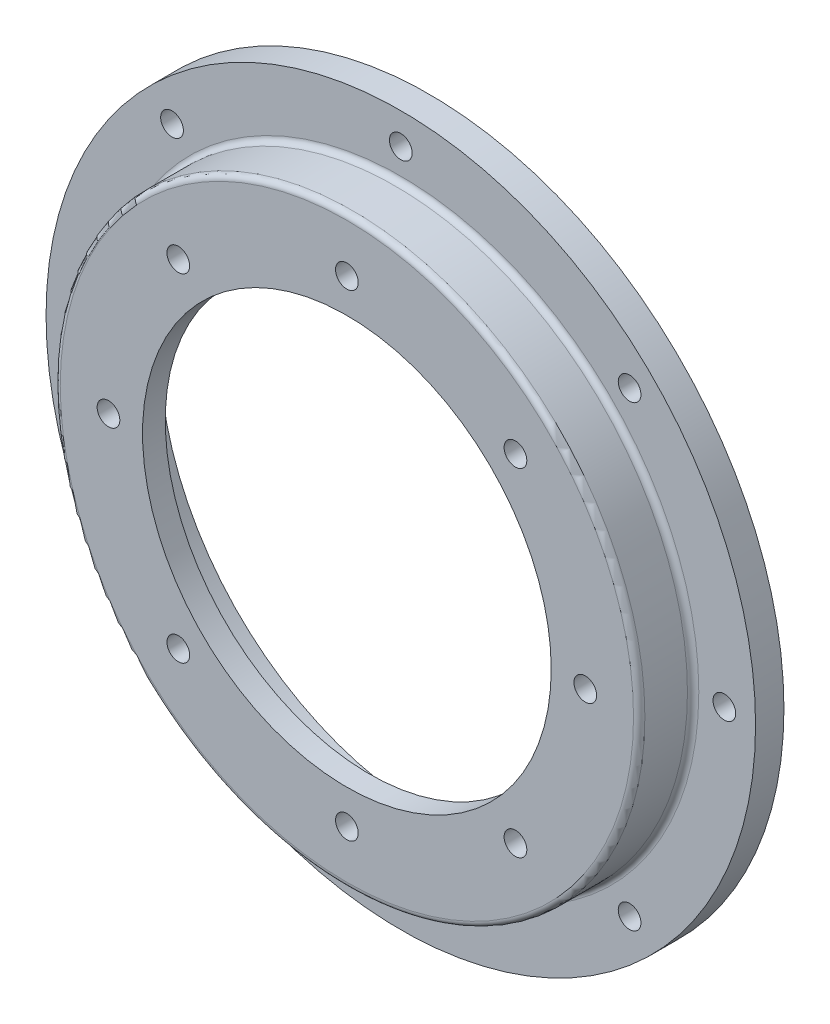
ISO-10303-21;
HEADER;
FILE_DESCRIPTION(('STEP AP214'),'2;1');
FILE_NAME('part.step','',(''),(''),'','','');
FILE_SCHEMA(('AUTOMOTIVE_DESIGN { 1 0 10303 214 1 1 1 1 }'));
ENDSEC;
DATA;
#1=APPLICATION_CONTEXT('core data for automotive mechanical design processes');
#2=APPLICATION_PROTOCOL_DEFINITION('international standard','automotive_design',2000,#1);
#3=PRODUCT_CONTEXT('',#1,'mechanical');
#4=PRODUCT('Part','Part','',(#3));
#5=PRODUCT_RELATED_PRODUCT_CATEGORY('part','',(#4));
#6=PRODUCT_DEFINITION_FORMATION('','',#4);
#7=PRODUCT_DEFINITION_CONTEXT('part definition',#1,'design');
#8=PRODUCT_DEFINITION('design','',#6,#7);
#9=PRODUCT_DEFINITION_SHAPE('','',#8);
#10=(LENGTH_UNIT() NAMED_UNIT(*) SI_UNIT(.MILLI.,.METRE.));
#11=(NAMED_UNIT(*) PLANE_ANGLE_UNIT() SI_UNIT($,.RADIAN.));
#12=(NAMED_UNIT(*) SI_UNIT($,.STERADIAN.) SOLID_ANGLE_UNIT());
#13=UNCERTAINTY_MEASURE_WITH_UNIT(LENGTH_MEASURE(1.E-05),#10,'distance_accuracy_value','');
#14=(GEOMETRIC_REPRESENTATION_CONTEXT(3) GLOBAL_UNCERTAINTY_ASSIGNED_CONTEXT((#13)) GLOBAL_UNIT_ASSIGNED_CONTEXT((#10,
#11,#12)) REPRESENTATION_CONTEXT('',''));
#15=CARTESIAN_POINT('',(0.,0.,0.));
#16=DIRECTION('',(0.,0.,1.));
#17=DIRECTION('',(1.,0.,0.));
#18=AXIS2_PLACEMENT_3D('',#15,#16,#17);
#19=CARTESIAN_POINT('',(0.,0.,0.));
#20=DIRECTION('',(0.,0.,1.));
#21=DIRECTION('',(1.,0.,0.));
#22=AXIS2_PLACEMENT_3D('',#19,#20,#21);
#23=PLANE('',#22);
#24=CARTESIAN_POINT('',(0.,0.,0.));
#25=DIRECTION('',(0.,0.,1.));
#26=DIRECTION('',(1.,0.,0.));
#27=AXIS2_PLACEMENT_3D('',#24,#25,#26);
#28=CIRCLE('',#27,62.5);
#29=CARTESIAN_POINT('',(62.5,0.,0.));
#30=VERTEX_POINT('',#29);
#31=EDGE_CURVE('E108',#30,#30,#28,.T.);
#32=ORIENTED_EDGE('',*,*,#31,.F.);
#33=EDGE_LOOP('',(#32));
#34=FACE_BOUND('',#33,.T.);
#35=CARTESIAN_POINT('',(40.3050865276339,40.3050865276349,0.));
#36=DIRECTION('',(0.,0.,-1.));
#37=DIRECTION('',(-1.,0.,0.));
#38=AXIS2_PLACEMENT_3D('',#35,#36,#37);
#39=CIRCLE('',#38,2.025);
#40=CARTESIAN_POINT('',(38.2800865276339,40.3050865276349,0.));
#41=VERTEX_POINT('',#40);
#42=EDGE_CURVE('E117',#41,#41,#39,.T.);
#43=ORIENTED_EDGE('',*,*,#42,.F.);
#44=EDGE_LOOP('',(#43));
#45=FACE_BOUND('',#44,.T.);
#46=CARTESIAN_POINT('',(57.0000000000023,2.33481015659528E-12,0.));
#47=DIRECTION('',(0.,0.,-1.));
#48=DIRECTION('',(-1.,0.,0.));
#49=AXIS2_PLACEMENT_3D('',#46,#47,#48);
#50=CIRCLE('',#49,2.025);
#51=CARTESIAN_POINT('',(54.9750000000023,2.33481015659528E-12,0.));
#52=VERTEX_POINT('',#51);
#53=EDGE_CURVE('E124',#52,#52,#50,.T.);
#54=ORIENTED_EDGE('',*,*,#53,.F.);
#55=EDGE_LOOP('',(#54));
#56=FACE_BOUND('',#55,.T.);
#57=CARTESIAN_POINT('',(40.3050865276372,-40.3050865276316,0.));
#58=DIRECTION('',(0.,0.,-1.));
#59=DIRECTION('',(-1.,0.,0.));
#60=AXIS2_PLACEMENT_3D('',#57,#58,#59);
#61=CIRCLE('',#60,2.025);
#62=CARTESIAN_POINT('',(38.2800865276372,-40.3050865276316,0.));
#63=VERTEX_POINT('',#62);
#64=EDGE_CURVE('E131',#63,#63,#61,.T.);
#65=ORIENTED_EDGE('',*,*,#64,.F.);
#66=EDGE_LOOP('',(#65));
#67=FACE_BOUND('',#66,.T.);
#68=CARTESIAN_POINT('',(4.66962031319056E-12,-57.,0.));
#69=DIRECTION('',(0.,0.,-1.));
#70=DIRECTION('',(-1.,0.,0.));
#71=AXIS2_PLACEMENT_3D('',#68,#69,#70);
#72=CIRCLE('',#71,2.025);
#73=CARTESIAN_POINT('',(-2.02499999999533,-57.,0.));
#74=VERTEX_POINT('',#73);
#75=EDGE_CURVE('E138',#74,#74,#72,.T.);
#76=ORIENTED_EDGE('',*,*,#75,.F.);
#77=EDGE_LOOP('',(#76));
#78=FACE_BOUND('',#77,.T.);
#79=CARTESIAN_POINT('',(-40.3050865276292,-40.3050865276349,0.));
#80=DIRECTION('',(0.,0.,-1.));
#81=DIRECTION('',(-1.,0.,0.));
#82=AXIS2_PLACEMENT_3D('',#79,#80,#81);
#83=CIRCLE('',#82,2.025);
#84=CARTESIAN_POINT('',(-42.3300865276292,-40.3050865276349,0.));
#85=VERTEX_POINT('',#84);
#86=EDGE_CURVE('E81',#85,#85,#83,.T.);
#87=ORIENTED_EDGE('',*,*,#86,.F.);
#88=EDGE_LOOP('',(#87));
#89=FACE_BOUND('',#88,.T.);
#90=CARTESIAN_POINT('',(-56.9999999999977,-2.34179064335042E-12,0.));
#91=DIRECTION('',(0.,0.,-1.));
#92=DIRECTION('',(-1.,0.,0.));
#93=AXIS2_PLACEMENT_3D('',#90,#91,#92);
#94=CIRCLE('',#93,2.025);
#95=CARTESIAN_POINT('',(-59.0249999999977,-2.34179064335042E-12,0.));
#96=VERTEX_POINT('',#95);
#97=EDGE_CURVE('E152',#96,#96,#94,.T.);
#98=ORIENTED_EDGE('',*,*,#97,.F.);
#99=EDGE_LOOP('',(#98));
#100=FACE_BOUND('',#99,.T.);
#101=CARTESIAN_POINT('',(-40.3050865276325,40.3050865276316,0.));
#102=DIRECTION('',(0.,0.,-1.));
#103=DIRECTION('',(-1.,0.,0.));
#104=AXIS2_PLACEMENT_3D('',#101,#102,#103);
#105=CIRCLE('',#104,2.025);
#106=CARTESIAN_POINT('',(-42.3300865276325,40.3050865276316,0.));
#107=VERTEX_POINT('',#106);
#108=EDGE_CURVE('E162',#107,#107,#105,.T.);
#109=ORIENTED_EDGE('',*,*,#108,.F.);
#110=EDGE_LOOP('',(#109));
#111=FACE_BOUND('',#110,.T.);
#112=CARTESIAN_POINT('',(0.,57.,0.));
#113=DIRECTION('',(0.,0.,-1.));
#114=DIRECTION('',(-1.,0.,0.));
#115=AXIS2_PLACEMENT_3D('',#112,#113,#114);
#116=CIRCLE('',#115,2.025);
#117=CARTESIAN_POINT('',(-2.025,57.,0.));
#118=VERTEX_POINT('',#117);
#119=EDGE_CURVE('E169',#118,#118,#116,.T.);
#120=ORIENTED_EDGE('',*,*,#119,.F.);
#121=EDGE_LOOP('',(#120));
#122=FACE_BOUND('',#121,.T.);
#123=CARTESIAN_POINT('',(0.,0.,0.));
#124=DIRECTION('',(0.,0.,1.));
#125=DIRECTION('',(1.,0.,0.));
#126=AXIS2_PLACEMENT_3D('',#123,#124,#125);
#127=CIRCLE('',#126,47.5);
#128=CARTESIAN_POINT('',(-47.5,0.,0.));
#129=VERTEX_POINT('',#128);
#130=EDGE_CURVE('E192',#129,#129,#127,.T.);
#131=ORIENTED_EDGE('',*,*,#130,.T.);
#132=EDGE_LOOP('',(#131));
#133=FACE_BOUND('',#132,.T.);
#134=ADVANCED_FACE('F36',(#34,#45,#56,#67,#78,#89,#100,#111,#122,#133),#23,.F.);
#135=CARTESIAN_POINT('',(0.,0.,14.5));
#136=DIRECTION('',(0.,0.,1.));
#137=DIRECTION('',(1.,0.,0.));
#138=AXIS2_PLACEMENT_3D('',#135,#136,#137);
#139=PLANE('',#138);
#140=CARTESIAN_POINT('',(0.,0.,14.5));
#141=DIRECTION('',(0.,0.,1.));
#142=DIRECTION('',(1.,0.,0.));
#143=AXIS2_PLACEMENT_3D('',#140,#141,#142);
#144=CIRCLE('',#143,50.5);
#145=CARTESIAN_POINT('',(50.5,0.,14.5));
#146=VERTEX_POINT('',#145);
#147=EDGE_CURVE('E10',#146,#146,#144,.T.);
#148=ORIENTED_EDGE('',*,*,#147,.T.);
#149=EDGE_LOOP('',(#148));
#150=FACE_BOUND('',#149,.T.);
#151=CARTESIAN_POINT('',(0.,42.,14.5));
#152=DIRECTION('',(0.,0.,-1.));
#153=DIRECTION('',(-1.,0.,0.));
#154=AXIS2_PLACEMENT_3D('',#151,#152,#153);
#155=CIRCLE('',#154,2.);
#156=CARTESIAN_POINT('',(-2.,42.,14.5));
#157=VERTEX_POINT('',#156);
#158=EDGE_CURVE('E71',#157,#157,#155,.T.);
#159=ORIENTED_EDGE('',*,*,#158,.T.);
#160=EDGE_LOOP('',(#159));
#161=FACE_BOUND('',#160,.T.);
#162=CARTESIAN_POINT('',(-29.6984848098345,29.6984848098337,14.5));
#163=DIRECTION('',(0.,0.,-1.));
#164=DIRECTION('',(-1.,0.,0.));
#165=AXIS2_PLACEMENT_3D('',#162,#163,#164);
#166=CIRCLE('',#165,2.);
#167=CARTESIAN_POINT('',(-31.6984848098345,29.6984848098337,14.5));
#168=VERTEX_POINT('',#167);
#169=EDGE_CURVE('E76',#168,#168,#166,.T.);
#170=ORIENTED_EDGE('',*,*,#169,.T.);
#171=EDGE_LOOP('',(#170));
#172=FACE_BOUND('',#171,.T.);
#173=CARTESIAN_POINT('',(-41.9999999999982,-1.78799593583724E-12,14.5));
#174=DIRECTION('',(0.,0.,-1.));
#175=DIRECTION('',(-1.,0.,0.));
#176=AXIS2_PLACEMENT_3D('',#173,#174,#175);
#177=CIRCLE('',#176,1.99999999999999);
#178=CARTESIAN_POINT('',(-43.9999999999982,-1.78799593583724E-12,14.5));
#179=VERTEX_POINT('',#178);
#180=EDGE_CURVE('E155',#179,#179,#177,.T.);
#181=ORIENTED_EDGE('',*,*,#180,.T.);
#182=EDGE_LOOP('',(#181));
#183=FACE_BOUND('',#182,.T.);
#184=CARTESIAN_POINT('',(-29.698484809832,-29.6984848098363,14.5));
#185=DIRECTION('',(0.,0.,-1.));
#186=DIRECTION('',(-1.,0.,0.));
#187=AXIS2_PLACEMENT_3D('',#184,#185,#186);
#188=CIRCLE('',#187,1.99999999999999);
#189=CARTESIAN_POINT('',(-31.6984848098319,-29.6984848098363,14.5));
#190=VERTEX_POINT('',#189);
#191=EDGE_CURVE('E86',#190,#190,#188,.T.);
#192=ORIENTED_EDGE('',*,*,#191,.T.);
#193=EDGE_LOOP('',(#192));
#194=FACE_BOUND('',#193,.T.);
#195=CARTESIAN_POINT('',(3.56570483856165E-12,-42.,14.5));
#196=DIRECTION('',(0.,0.,-1.));
#197=DIRECTION('',(-1.,0.,0.));
#198=AXIS2_PLACEMENT_3D('',#195,#196,#197);
#199=CIRCLE('',#198,2.);
#200=CARTESIAN_POINT('',(-1.99999999999643,-42.,14.5));
#201=VERTEX_POINT('',#200);
#202=EDGE_CURVE('E141',#201,#201,#199,.T.);
#203=ORIENTED_EDGE('',*,*,#202,.T.);
#204=EDGE_LOOP('',(#203));
#205=FACE_BOUND('',#204,.T.);
#206=CARTESIAN_POINT('',(29.698484809838,-29.6984848098337,14.5));
#207=DIRECTION('',(0.,0.,-1.));
#208=DIRECTION('',(-1.,0.,0.));
#209=AXIS2_PLACEMENT_3D('',#206,#207,#208);
#210=CIRCLE('',#209,1.99999999999999);
#211=CARTESIAN_POINT('',(27.698484809838,-29.6984848098337,14.5));
#212=VERTEX_POINT('',#211);
#213=EDGE_CURVE('E91',#212,#212,#210,.T.);
#214=ORIENTED_EDGE('',*,*,#213,.T.);
#215=EDGE_LOOP('',(#214));
#216=FACE_BOUND('',#215,.T.);
#217=CARTESIAN_POINT('',(42.0000000000018,1.78285241928082E-12,14.5));
#218=DIRECTION('',(0.,0.,-1.));
#219=DIRECTION('',(-1.,0.,0.));
#220=AXIS2_PLACEMENT_3D('',#217,#218,#219);
#221=CIRCLE('',#220,1.99999999999999);
#222=CARTESIAN_POINT('',(40.0000000000018,1.78285241928082E-12,14.5));
#223=VERTEX_POINT('',#222);
#224=EDGE_CURVE('E96',#223,#223,#221,.T.);
#225=ORIENTED_EDGE('',*,*,#224,.T.);
#226=EDGE_LOOP('',(#225));
#227=FACE_BOUND('',#226,.T.);
#228=CARTESIAN_POINT('',(0.,0.,14.5));
#229=DIRECTION('',(0.,0.,1.));
#230=DIRECTION('',(1.,0.,0.));
#231=AXIS2_PLACEMENT_3D('',#228,#229,#230);
#232=CIRCLE('',#231,36.);
#233=CARTESIAN_POINT('',(36.,0.,14.5));
#234=VERTEX_POINT('',#233);
#235=EDGE_CURVE('E106',#234,#234,#232,.T.);
#236=ORIENTED_EDGE('',*,*,#235,.F.);
#237=EDGE_LOOP('',(#236));
#238=FACE_BOUND('',#237,.T.);
#239=CARTESIAN_POINT('',(29.6984848098355,29.6984848098363,14.5));
#240=DIRECTION('',(0.,0.,-1.));
#241=DIRECTION('',(-1.,0.,0.));
#242=AXIS2_PLACEMENT_3D('',#239,#240,#241);
#243=CIRCLE('',#242,1.99999999999999);
#244=CARTESIAN_POINT('',(27.6984848098355,29.6984848098363,14.5));
#245=VERTEX_POINT('',#244);
#246=EDGE_CURVE('E101',#245,#245,#243,.T.);
#247=ORIENTED_EDGE('',*,*,#246,.T.);
#248=EDGE_LOOP('',(#247));
#249=FACE_BOUND('',#248,.T.);
#250=ADVANCED_FACE('F209',(#150,#161,#172,#183,#194,#205,#216,#227,#238,#249),#139,.T.);
#251=CARTESIAN_POINT('',(0.,0.,5.));
#252=DIRECTION('',(0.,0.,-1.));
#253=DIRECTION('',(-1.,0.,0.));
#254=AXIS2_PLACEMENT_3D('',#251,#252,#253);
#255=CYLINDRICAL_SURFACE('',#254,62.5);
#256=CARTESIAN_POINT('',(0.,0.,5.));
#257=DIRECTION('',(0.,0.,1.));
#258=DIRECTION('',(1.,0.,0.));
#259=AXIS2_PLACEMENT_3D('',#256,#257,#258);
#260=CIRCLE('',#259,62.5);
#261=CARTESIAN_POINT('',(62.5,0.,5.));
#262=VERTEX_POINT('',#261);
#263=EDGE_CURVE('E62',#262,#262,#260,.T.);
#264=ORIENTED_EDGE('',*,*,#263,.F.);
#265=EDGE_LOOP('',(#264));
#266=FACE_BOUND('',#265,.T.);
#267=ORIENTED_EDGE('',*,*,#31,.T.);
#268=EDGE_LOOP('',(#267));
#269=FACE_BOUND('',#268,.T.);
#270=ADVANCED_FACE('F205',(#266,#269),#255,.T.);
#271=CARTESIAN_POINT('',(0.,0.,5.));
#272=DIRECTION('',(0.,0.,-1.));
#273=DIRECTION('',(-1.,0.,0.));
#274=AXIS2_PLACEMENT_3D('',#271,#272,#273);
#275=CYLINDRICAL_SURFACE('',#274,36.);
#276=CARTESIAN_POINT('',(0.,0.,10.5));
#277=DIRECTION('',(0.,0.,1.));
#278=DIRECTION('',(1.,0.,0.));
#279=AXIS2_PLACEMENT_3D('',#276,#277,#278);
#280=CIRCLE('',#279,36.);
#281=CARTESIAN_POINT('',(36.,0.,10.5));
#282=VERTEX_POINT('',#281);
#283=EDGE_CURVE('E67',#282,#282,#280,.T.);
#284=ORIENTED_EDGE('',*,*,#283,.F.);
#285=EDGE_LOOP('',(#284));
#286=FACE_BOUND('',#285,.T.);
#287=ORIENTED_EDGE('',*,*,#235,.T.);
#288=EDGE_LOOP('',(#287));
#289=FACE_BOUND('',#288,.T.);
#290=ADVANCED_FACE('F201',(#286,#289),#275,.F.);
#291=CARTESIAN_POINT('',(0.,0.,5.));
#292=DIRECTION('',(0.,0.,1.));
#293=DIRECTION('',(1.,0.,0.));
#294=AXIS2_PLACEMENT_3D('',#291,#292,#293);
#295=PLANE('',#294);
#296=CARTESIAN_POINT('',(0.,0.,5.));
#297=DIRECTION('',(0.,0.,1.));
#298=DIRECTION('',(1.,0.,0.));
#299=AXIS2_PLACEMENT_3D('',#296,#297,#298);
#300=CIRCLE('',#299,52.5);
#301=CARTESIAN_POINT('',(52.5,0.,5.));
#302=VERTEX_POINT('',#301);
#303=EDGE_CURVE('E51',#302,#302,#300,.F.);
#304=ORIENTED_EDGE('',*,*,#303,.T.);
#305=EDGE_LOOP('',(#304));
#306=FACE_BOUND('',#305,.T.);
#307=CARTESIAN_POINT('',(0.,57.,5.));
#308=DIRECTION('',(0.,0.,1.));
#309=DIRECTION('',(1.,0.,0.));
#310=AXIS2_PLACEMENT_3D('',#307,#308,#309);
#311=CIRCLE('',#310,1.99999999999999);
#312=CARTESIAN_POINT('',(1.99999999999999,57.,5.));
#313=VERTEX_POINT('',#312);
#314=EDGE_CURVE('E68',#313,#313,#311,.T.);
#315=ORIENTED_EDGE('',*,*,#314,.F.);
#316=EDGE_LOOP('',(#315));
#317=FACE_BOUND('',#316,.T.);
#318=CARTESIAN_POINT('',(-40.3050865276325,40.3050865276316,5.));
#319=DIRECTION('',(0.,0.,1.));
#320=DIRECTION('',(1.,0.,0.));
#321=AXIS2_PLACEMENT_3D('',#318,#319,#320);
#322=CIRCLE('',#321,1.99999999999999);
#323=CARTESIAN_POINT('',(-38.3050865276325,40.3050865276316,5.));
#324=VERTEX_POINT('',#323);
#325=EDGE_CURVE('E73',#324,#324,#322,.T.);
#326=ORIENTED_EDGE('',*,*,#325,.F.);
#327=EDGE_LOOP('',(#326));
#328=FACE_BOUND('',#327,.T.);
#329=CARTESIAN_POINT('',(-56.9999999999977,-2.34179064335042E-12,5.));
#330=DIRECTION('',(0.,0.,1.));
#331=DIRECTION('',(1.,0.,0.));
#332=AXIS2_PLACEMENT_3D('',#329,#330,#331);
#333=CIRCLE('',#332,1.99999999999999);
#334=CARTESIAN_POINT('',(-54.9999999999977,-2.34179064335042E-12,5.));
#335=VERTEX_POINT('',#334);
#336=EDGE_CURVE('E78',#335,#335,#333,.T.);
#337=ORIENTED_EDGE('',*,*,#336,.F.);
#338=EDGE_LOOP('',(#337));
#339=FACE_BOUND('',#338,.T.);
#340=CARTESIAN_POINT('',(-40.3050865276292,-40.3050865276349,5.));
#341=DIRECTION('',(0.,0.,1.));
#342=DIRECTION('',(1.,0.,0.));
#343=AXIS2_PLACEMENT_3D('',#340,#341,#342);
#344=CIRCLE('',#343,1.99999999999999);
#345=CARTESIAN_POINT('',(-38.3050865276292,-40.3050865276349,5.));
#346=VERTEX_POINT('',#345);
#347=EDGE_CURVE('E83',#346,#346,#344,.T.);
#348=ORIENTED_EDGE('',*,*,#347,.F.);
#349=EDGE_LOOP('',(#348));
#350=FACE_BOUND('',#349,.T.);
#351=CARTESIAN_POINT('',(4.66962031319056E-12,-57.,5.));
#352=DIRECTION('',(0.,0.,1.));
#353=DIRECTION('',(1.,0.,0.));
#354=AXIS2_PLACEMENT_3D('',#351,#352,#353);
#355=CIRCLE('',#354,1.99999999999999);
#356=CARTESIAN_POINT('',(2.00000000000466,-57.,5.));
#357=VERTEX_POINT('',#356);
#358=EDGE_CURVE('E88',#357,#357,#355,.T.);
#359=ORIENTED_EDGE('',*,*,#358,.F.);
#360=EDGE_LOOP('',(#359));
#361=FACE_BOUND('',#360,.T.);
#362=CARTESIAN_POINT('',(40.3050865276372,-40.3050865276316,5.));
#363=DIRECTION('',(0.,0.,1.));
#364=DIRECTION('',(1.,0.,0.));
#365=AXIS2_PLACEMENT_3D('',#362,#363,#364);
#366=CIRCLE('',#365,1.99999999999999);
#367=CARTESIAN_POINT('',(42.3050865276372,-40.3050865276316,5.));
#368=VERTEX_POINT('',#367);
#369=EDGE_CURVE('E93',#368,#368,#366,.T.);
#370=ORIENTED_EDGE('',*,*,#369,.F.);
#371=EDGE_LOOP('',(#370));
#372=FACE_BOUND('',#371,.T.);
#373=CARTESIAN_POINT('',(57.0000000000023,2.33481015659528E-12,5.));
#374=DIRECTION('',(0.,0.,1.));
#375=DIRECTION('',(1.,0.,0.));
#376=AXIS2_PLACEMENT_3D('',#373,#374,#375);
#377=CIRCLE('',#376,1.99999999999999);
#378=CARTESIAN_POINT('',(59.0000000000023,2.33481015659528E-12,5.));
#379=VERTEX_POINT('',#378);
#380=EDGE_CURVE('E98',#379,#379,#377,.T.);
#381=ORIENTED_EDGE('',*,*,#380,.F.);
#382=EDGE_LOOP('',(#381));
#383=FACE_BOUND('',#382,.T.);
#384=CARTESIAN_POINT('',(40.3050865276339,40.3050865276349,5.));
#385=DIRECTION('',(0.,0.,1.));
#386=DIRECTION('',(1.,0.,0.));
#387=AXIS2_PLACEMENT_3D('',#384,#385,#386);
#388=CIRCLE('',#387,1.99999999999999);
#389=CARTESIAN_POINT('',(42.3050865276339,40.3050865276349,5.));
#390=VERTEX_POINT('',#389);
#391=EDGE_CURVE('E103',#390,#390,#388,.T.);
#392=ORIENTED_EDGE('',*,*,#391,.F.);
#393=EDGE_LOOP('',(#392));
#394=FACE_BOUND('',#393,.T.);
#395=ORIENTED_EDGE('',*,*,#263,.T.);
#396=EDGE_LOOP('',(#395));
#397=FACE_BOUND('',#396,.T.);
#398=ADVANCED_FACE('F204',(#306,#317,#328,#339,#350,#361,#372,#383,#394,#397),#295,.T.);
#399=CARTESIAN_POINT('',(0.,0.,14.5));
#400=DIRECTION('',(0.,0.,-1.));
#401=DIRECTION('',(-1.,0.,0.));
#402=AXIS2_PLACEMENT_3D('',#399,#400,#401);
#403=CYLINDRICAL_SURFACE('',#402,51.5);
#404=CARTESIAN_POINT('',(0.,0.,6.));
#405=DIRECTION('',(0.,0.,1.));
#406=DIRECTION('',(1.,0.,0.));
#407=AXIS2_PLACEMENT_3D('',#404,#405,#406);
#408=CIRCLE('',#407,51.5);
#409=CARTESIAN_POINT('',(-51.5,0.,6.));
#410=VERTEX_POINT('',#409);
#411=EDGE_CURVE('E43',#410,#410,#408,.T.);
#412=CARTESIAN_POINT('',(0.,0.,13.5));
#413=DIRECTION('',(0.,0.,1.));
#414=DIRECTION('',(1.,0.,0.));
#415=AXIS2_PLACEMENT_3D('',#412,#413,#414);
#416=CIRCLE('',#415,51.5);
#417=CARTESIAN_POINT('',(-51.5,0.,13.5));
#418=VERTEX_POINT('',#417);
#419=EDGE_CURVE('E47',#418,#418,#416,.F.);
#420=CARTESIAN_POINT('',(-51.5,0.,6.));
#421=CARTESIAN_POINT('',(-51.5,0.,6.078125));
#422=CARTESIAN_POINT('',(-51.5,0.,6.15625));
#423=CARTESIAN_POINT('',(-51.5,0.,6.3125));
#424=CARTESIAN_POINT('',(-51.5,0.,6.390625));
#425=CARTESIAN_POINT('',(-51.5,0.,6.546875));
#426=CARTESIAN_POINT('',(-51.5,0.,6.625));
#427=CARTESIAN_POINT('',(-51.5,0.,6.78125));
#428=CARTESIAN_POINT('',(-51.5,0.,6.859375));
#429=CARTESIAN_POINT('',(-51.5,0.,7.015625));
#430=CARTESIAN_POINT('',(-51.5,0.,7.09375));
#431=CARTESIAN_POINT('',(-51.5,0.,7.25));
#432=CARTESIAN_POINT('',(-51.5,0.,7.328125));
#433=CARTESIAN_POINT('',(-51.5,0.,7.484375));
#434=CARTESIAN_POINT('',(-51.5,0.,7.5625));
#435=CARTESIAN_POINT('',(-51.5,0.,7.71875));
#436=CARTESIAN_POINT('',(-51.5,0.,7.796875));
#437=CARTESIAN_POINT('',(-51.5,0.,7.953125));
#438=CARTESIAN_POINT('',(-51.5,0.,8.03125));
#439=CARTESIAN_POINT('',(-51.5,0.,8.1875));
#440=CARTESIAN_POINT('',(-51.5,0.,8.265625));
#441=CARTESIAN_POINT('',(-51.5,0.,8.421875));
#442=CARTESIAN_POINT('',(-51.5,0.,8.5));
#443=CARTESIAN_POINT('',(-51.5,0.,8.65625));
#444=CARTESIAN_POINT('',(-51.5,0.,8.734375));
#445=CARTESIAN_POINT('',(-51.5,0.,8.890625));
#446=CARTESIAN_POINT('',(-51.5,0.,8.96875));
#447=CARTESIAN_POINT('',(-51.5,0.,9.125));
#448=CARTESIAN_POINT('',(-51.5,0.,9.203125));
#449=CARTESIAN_POINT('',(-51.5,0.,9.359375));
#450=CARTESIAN_POINT('',(-51.5,0.,9.4375));
#451=CARTESIAN_POINT('',(-51.5,0.,9.59375));
#452=CARTESIAN_POINT('',(-51.5,0.,9.671875));
#453=CARTESIAN_POINT('',(-51.5,0.,9.828125));
#454=CARTESIAN_POINT('',(-51.5,0.,9.90625));
#455=CARTESIAN_POINT('',(-51.5,0.,10.0625));
#456=CARTESIAN_POINT('',(-51.5,0.,10.140625));
#457=CARTESIAN_POINT('',(-51.5,0.,10.296875));
#458=CARTESIAN_POINT('',(-51.5,0.,10.375));
#459=CARTESIAN_POINT('',(-51.5,0.,10.53125));
#460=CARTESIAN_POINT('',(-51.5,0.,10.609375));
#461=CARTESIAN_POINT('',(-51.5,0.,10.765625));
#462=CARTESIAN_POINT('',(-51.5,0.,10.84375));
#463=CARTESIAN_POINT('',(-51.5,0.,11.));
#464=CARTESIAN_POINT('',(-51.5,0.,11.078125));
#465=CARTESIAN_POINT('',(-51.5,0.,11.234375));
#466=CARTESIAN_POINT('',(-51.5,0.,11.3125));
#467=CARTESIAN_POINT('',(-51.5,0.,11.46875));
#468=CARTESIAN_POINT('',(-51.5,0.,11.546875));
#469=CARTESIAN_POINT('',(-51.5,0.,11.703125));
#470=CARTESIAN_POINT('',(-51.5,0.,11.78125));
#471=CARTESIAN_POINT('',(-51.5,0.,11.9375));
#472=CARTESIAN_POINT('',(-51.5,0.,12.015625));
#473=CARTESIAN_POINT('',(-51.5,0.,12.171875));
#474=CARTESIAN_POINT('',(-51.5,0.,12.25));
#475=CARTESIAN_POINT('',(-51.5,0.,12.40625));
#476=CARTESIAN_POINT('',(-51.5,0.,12.484375));
#477=CARTESIAN_POINT('',(-51.5,0.,12.640625));
#478=CARTESIAN_POINT('',(-51.5,0.,12.71875));
#479=CARTESIAN_POINT('',(-51.5,0.,12.875));
#480=CARTESIAN_POINT('',(-51.5,0.,12.953125));
#481=CARTESIAN_POINT('',(-51.5,0.,13.109375));
#482=CARTESIAN_POINT('',(-51.5,0.,13.1875));
#483=CARTESIAN_POINT('',(-51.5,0.,13.34375));
#484=CARTESIAN_POINT('',(-51.5,0.,13.421875));
#485=CARTESIAN_POINT('',(-51.5,0.,13.5));
#486=B_SPLINE_CURVE_WITH_KNOTS('',3,(#420,#421,#422,#423,#424,#425,#426,#427,#428,#429,#430,
#431,#432,#433,#434,#435,#436,#437,#438,#439,#440,#441,#442,#443,#444,#445,#446,#447,#448,#449,
#450,#451,#452,#453,#454,#455,#456,#457,#458,#459,#460,#461,#462,#463,#464,#465,#466,#467,#468,
#469,#470,#471,#472,#473,#474,#475,#476,#477,#478,#479,#480,#481,#482,#483,#484,#485),
.UNSPECIFIED.,.F.,.F.,(4,2,2,2,2,2,2,2,2,2,2,2,2,2,2,2,2,2,2,2,2,2,2,2,2,2,2,2,2,2,2,2,4),(0.,
0.234375,0.46875,0.703125,0.9375,1.171875,1.40625,1.640625,1.875,2.109375,2.34375,2.578125,
2.8125,3.046875,3.28125,3.515625,3.75,3.984375,4.21875,4.453125,4.6875,4.921875,5.15625,
5.390625,5.625,5.859375,6.09375,6.328125,6.5625,6.796875,7.03125,7.265625,7.5),.UNSPECIFIED.);
#487=EDGE_CURVE('BSEAM260',#410,#418,#486,.T.);
#488=ORIENTED_EDGE('',*,*,#411,.T.);
#489=ORIENTED_EDGE('',*,*,#419,.T.);
#490=ORIENTED_EDGE('',*,*,#487,.T.);
#491=ORIENTED_EDGE('',*,*,#487,.F.);
#492=EDGE_LOOP('',(#488,#490,#489,#491));
#493=FACE_BOUND('',#492,.T.);
#494=ADVANCED_FACE('F260',(#493),#403,.T.);
#495=CARTESIAN_POINT('',(40.3050865276339,40.3050865276349,0.));
#496=DIRECTION('',(0.,0.,-1.));
#497=DIRECTION('',(-1.,0.,0.));
#498=AXIS2_PLACEMENT_3D('',#495,#496,#497);
#499=CYLINDRICAL_SURFACE('',#498,1.99999999999999);
#500=ORIENTED_EDGE('',*,*,#391,.T.);
#501=EDGE_LOOP('',(#500));
#502=FACE_BOUND('',#501,.T.);
#503=CARTESIAN_POINT('',(40.3050865276339,40.3050865276349,0.0249999999999972));
#504=DIRECTION('',(0.,0.,-1.));
#505=DIRECTION('',(-1.,0.,0.));
#506=AXIS2_PLACEMENT_3D('',#503,#504,#505);
#507=CIRCLE('',#506,1.99999999999999);
#508=CARTESIAN_POINT('',(38.3050865276339,40.3050865276349,0.0249999999999972));
#509=VERTEX_POINT('',#508);
#510=EDGE_CURVE('E107',#509,#509,#507,.T.);
#511=ORIENTED_EDGE('',*,*,#510,.T.);
#512=EDGE_LOOP('',(#511));
#513=FACE_BOUND('',#512,.T.);
#514=ADVANCED_FACE('F228',(#502,#513),#499,.F.);
#515=CARTESIAN_POINT('',(40.3050865276339,40.3050865276349,0.));
#516=DIRECTION('',(0.,0.,-1.));
#517=DIRECTION('',(-1.,0.,0.));
#518=AXIS2_PLACEMENT_3D('',#515,#516,#517);
#519=CONICAL_SURFACE('',#518,2.025,0.785398163397691);
#520=ORIENTED_EDGE('',*,*,#510,.F.);
#521=EDGE_LOOP('',(#520));
#522=FACE_BOUND('',#521,.T.);
#523=ORIENTED_EDGE('',*,*,#42,.T.);
#524=EDGE_LOOP('',(#523));
#525=FACE_BOUND('',#524,.T.);
#526=ADVANCED_FACE('F218',(#522,#525),#519,.F.);
#527=CARTESIAN_POINT('',(29.6984848098355,29.6984848098363,0.));
#528=DIRECTION('',(0.,0.,-1.));
#529=DIRECTION('',(-1.,0.,0.));
#530=AXIS2_PLACEMENT_3D('',#527,#528,#529);
#531=CYLINDRICAL_SURFACE('',#530,1.99999999999999);
#532=CARTESIAN_POINT('',(29.6984848098355,29.6984848098363,10.5));
#533=DIRECTION('',(0.,0.,1.));
#534=DIRECTION('',(1.,0.,0.));
#535=AXIS2_PLACEMENT_3D('',#532,#533,#534);
#536=CIRCLE('',#535,1.99999999999999);
#537=CARTESIAN_POINT('',(31.6984848098355,29.6984848098363,10.5));
#538=VERTEX_POINT('',#537);
#539=EDGE_CURVE('E172',#538,#538,#536,.F.);
#540=ORIENTED_EDGE('',*,*,#539,.T.);
#541=EDGE_LOOP('',(#540));
#542=FACE_BOUND('',#541,.T.);
#543=ORIENTED_EDGE('',*,*,#246,.F.);
#544=EDGE_LOOP('',(#543));
#545=FACE_BOUND('',#544,.T.);
#546=ADVANCED_FACE('F215',(#542,#545),#531,.F.);
#547=CARTESIAN_POINT('',(57.0000000000023,2.33481015659528E-12,0.));
#548=DIRECTION('',(0.,0.,-1.));
#549=DIRECTION('',(-1.,0.,0.));
#550=AXIS2_PLACEMENT_3D('',#547,#548,#549);
#551=CYLINDRICAL_SURFACE('',#550,1.99999999999999);
#552=ORIENTED_EDGE('',*,*,#380,.T.);
#553=EDGE_LOOP('',(#552));
#554=FACE_BOUND('',#553,.T.);
#555=CARTESIAN_POINT('',(57.0000000000023,2.33481015659528E-12,0.0249999999999972));
#556=DIRECTION('',(0.,0.,-1.));
#557=DIRECTION('',(-1.,0.,0.));
#558=AXIS2_PLACEMENT_3D('',#555,#556,#557);
#559=CIRCLE('',#558,1.99999999999999);
#560=CARTESIAN_POINT('',(55.0000000000023,2.33481015659528E-12,0.0249999999999972));
#561=VERTEX_POINT('',#560);
#562=EDGE_CURVE('E102',#561,#561,#559,.T.);
#563=ORIENTED_EDGE('',*,*,#562,.T.);
#564=EDGE_LOOP('',(#563));
#565=FACE_BOUND('',#564,.T.);
#566=ADVANCED_FACE('F217',(#554,#565),#551,.F.);
#567=CARTESIAN_POINT('',(57.0000000000023,2.33481015659528E-12,0.));
#568=DIRECTION('',(0.,0.,-1.));
#569=DIRECTION('',(-1.,0.,0.));
#570=AXIS2_PLACEMENT_3D('',#567,#568,#569);
#571=CONICAL_SURFACE('',#570,2.025,0.785398163397691);
#572=ORIENTED_EDGE('',*,*,#562,.F.);
#573=EDGE_LOOP('',(#572));
#574=FACE_BOUND('',#573,.T.);
#575=ORIENTED_EDGE('',*,*,#53,.T.);
#576=EDGE_LOOP('',(#575));
#577=FACE_BOUND('',#576,.T.);
#578=ADVANCED_FACE('F225',(#574,#577),#571,.F.);
#579=CARTESIAN_POINT('',(42.0000000000018,1.78285241928082E-12,0.));
#580=DIRECTION('',(0.,0.,-1.));
#581=DIRECTION('',(-1.,0.,0.));
#582=AXIS2_PLACEMENT_3D('',#579,#580,#581);
#583=CYLINDRICAL_SURFACE('',#582,1.99999999999999);
#584=CARTESIAN_POINT('',(42.0000000000018,1.78285241928082E-12,10.5));
#585=DIRECTION('',(0.,0.,1.));
#586=DIRECTION('',(1.,0.,0.));
#587=AXIS2_PLACEMENT_3D('',#584,#585,#586);
#588=CIRCLE('',#587,1.99999999999999);
#589=CARTESIAN_POINT('',(44.0000000000018,1.78285241928082E-12,10.5));
#590=VERTEX_POINT('',#589);
#591=EDGE_CURVE('E175',#590,#590,#588,.F.);
#592=ORIENTED_EDGE('',*,*,#591,.T.);
#593=EDGE_LOOP('',(#592));
#594=FACE_BOUND('',#593,.T.);
#595=ORIENTED_EDGE('',*,*,#224,.F.);
#596=EDGE_LOOP('',(#595));
#597=FACE_BOUND('',#596,.T.);
#598=ADVANCED_FACE('F383',(#594,#597),#583,.F.);
#599=CARTESIAN_POINT('',(40.3050865276372,-40.3050865276316,0.));
#600=DIRECTION('',(0.,0.,-1.));
#601=DIRECTION('',(-1.,0.,0.));
#602=AXIS2_PLACEMENT_3D('',#599,#600,#601);
#603=CYLINDRICAL_SURFACE('',#602,1.99999999999999);
#604=ORIENTED_EDGE('',*,*,#369,.T.);
#605=EDGE_LOOP('',(#604));
#606=FACE_BOUND('',#605,.T.);
#607=CARTESIAN_POINT('',(40.3050865276372,-40.3050865276316,0.0249999999999972));
#608=DIRECTION('',(0.,0.,-1.));
#609=DIRECTION('',(-1.,0.,0.));
#610=AXIS2_PLACEMENT_3D('',#607,#608,#609);
#611=CIRCLE('',#610,1.99999999999999);
#612=CARTESIAN_POINT('',(38.3050865276372,-40.3050865276316,0.0249999999999972));
#613=VERTEX_POINT('',#612);
#614=EDGE_CURVE('E97',#613,#613,#611,.T.);
#615=ORIENTED_EDGE('',*,*,#614,.T.);
#616=EDGE_LOOP('',(#615));
#617=FACE_BOUND('',#616,.T.);
#618=ADVANCED_FACE('F379',(#606,#617),#603,.F.);
#619=CARTESIAN_POINT('',(40.3050865276372,-40.3050865276316,0.));
#620=DIRECTION('',(0.,0.,-1.));
#621=DIRECTION('',(-1.,0.,0.));
#622=AXIS2_PLACEMENT_3D('',#619,#620,#621);
#623=CONICAL_SURFACE('',#622,2.025,0.785398163397691);
#624=ORIENTED_EDGE('',*,*,#614,.F.);
#625=EDGE_LOOP('',(#624));
#626=FACE_BOUND('',#625,.T.);
#627=ORIENTED_EDGE('',*,*,#64,.T.);
#628=EDGE_LOOP('',(#627));
#629=FACE_BOUND('',#628,.T.);
#630=ADVANCED_FACE('F375',(#626,#629),#623,.F.);
#631=CARTESIAN_POINT('',(29.698484809838,-29.6984848098337,0.));
#632=DIRECTION('',(0.,0.,-1.));
#633=DIRECTION('',(-1.,0.,0.));
#634=AXIS2_PLACEMENT_3D('',#631,#632,#633);
#635=CYLINDRICAL_SURFACE('',#634,1.99999999999999);
#636=CARTESIAN_POINT('',(29.698484809838,-29.6984848098337,10.5));
#637=DIRECTION('',(0.,0.,1.));
#638=DIRECTION('',(1.,0.,0.));
#639=AXIS2_PLACEMENT_3D('',#636,#637,#638);
#640=CIRCLE('',#639,1.99999999999999);
#641=CARTESIAN_POINT('',(31.698484809838,-29.6984848098337,10.5));
#642=VERTEX_POINT('',#641);
#643=EDGE_CURVE('E178',#642,#642,#640,.F.);
#644=ORIENTED_EDGE('',*,*,#643,.T.);
#645=EDGE_LOOP('',(#644));
#646=FACE_BOUND('',#645,.T.);
#647=ORIENTED_EDGE('',*,*,#213,.F.);
#648=EDGE_LOOP('',(#647));
#649=FACE_BOUND('',#648,.T.);
#650=ADVANCED_FACE('F371',(#646,#649),#635,.F.);
#651=CARTESIAN_POINT('',(4.66962031319056E-12,-57.,0.));
#652=DIRECTION('',(0.,0.,-1.));
#653=DIRECTION('',(-1.,0.,0.));
#654=AXIS2_PLACEMENT_3D('',#651,#652,#653);
#655=CYLINDRICAL_SURFACE('',#654,1.99999999999999);
#656=ORIENTED_EDGE('',*,*,#358,.T.);
#657=EDGE_LOOP('',(#656));
#658=FACE_BOUND('',#657,.T.);
#659=CARTESIAN_POINT('',(4.66962031319056E-12,-57.,0.0249999999999972));
#660=DIRECTION('',(0.,0.,-1.));
#661=DIRECTION('',(-1.,0.,0.));
#662=AXIS2_PLACEMENT_3D('',#659,#660,#661);
#663=CIRCLE('',#662,1.99999999999999);
#664=CARTESIAN_POINT('',(-1.99999999999532,-57.,0.0249999999999972));
#665=VERTEX_POINT('',#664);
#666=EDGE_CURVE('E92',#665,#665,#663,.T.);
#667=ORIENTED_EDGE('',*,*,#666,.T.);
#668=EDGE_LOOP('',(#667));
#669=FACE_BOUND('',#668,.T.);
#670=ADVANCED_FACE('F367',(#658,#669),#655,.F.);
#671=CARTESIAN_POINT('',(4.66962031319056E-12,-57.,0.));
#672=DIRECTION('',(0.,0.,-1.));
#673=DIRECTION('',(-1.,0.,0.));
#674=AXIS2_PLACEMENT_3D('',#671,#672,#673);
#675=CONICAL_SURFACE('',#674,2.025,0.785398163397691);
#676=ORIENTED_EDGE('',*,*,#666,.F.);
#677=EDGE_LOOP('',(#676));
#678=FACE_BOUND('',#677,.T.);
#679=ORIENTED_EDGE('',*,*,#75,.T.);
#680=EDGE_LOOP('',(#679));
#681=FACE_BOUND('',#680,.T.);
#682=ADVANCED_FACE('F363',(#678,#681),#675,.F.);
#683=CARTESIAN_POINT('',(3.56570483856165E-12,-42.,0.));
#684=DIRECTION('',(0.,0.,-1.));
#685=DIRECTION('',(-1.,0.,0.));
#686=AXIS2_PLACEMENT_3D('',#683,#684,#685);
#687=CYLINDRICAL_SURFACE('',#686,1.99999999999999);
#688=CARTESIAN_POINT('',(3.56570483856165E-12,-42.,10.5));
#689=DIRECTION('',(0.,0.,1.));
#690=DIRECTION('',(1.,0.,0.));
#691=AXIS2_PLACEMENT_3D('',#688,#689,#690);
#692=CIRCLE('',#691,1.99999999999999);
#693=CARTESIAN_POINT('',(2.00000000000356,-42.,10.5));
#694=VERTEX_POINT('',#693);
#695=EDGE_CURVE('E181',#694,#694,#692,.F.);
#696=ORIENTED_EDGE('',*,*,#695,.T.);
#697=EDGE_LOOP('',(#696));
#698=FACE_BOUND('',#697,.T.);
#699=ORIENTED_EDGE('',*,*,#202,.F.);
#700=EDGE_LOOP('',(#699));
#701=FACE_BOUND('',#700,.T.);
#702=ADVANCED_FACE('F359',(#698,#701),#687,.F.);
#703=CARTESIAN_POINT('',(-29.698484809832,-29.6984848098363,0.));
#704=DIRECTION('',(0.,0.,-1.));
#705=DIRECTION('',(-1.,0.,0.));
#706=AXIS2_PLACEMENT_3D('',#703,#704,#705);
#707=CYLINDRICAL_SURFACE('',#706,1.99999999999999);
#708=CARTESIAN_POINT('',(-29.698484809832,-29.6984848098363,10.5));
#709=DIRECTION('',(0.,0.,1.));
#710=DIRECTION('',(1.,0.,0.));
#711=AXIS2_PLACEMENT_3D('',#708,#709,#710);
#712=CIRCLE('',#711,1.99999999999999);
#713=CARTESIAN_POINT('',(-27.698484809832,-29.6984848098363,10.5));
#714=VERTEX_POINT('',#713);
#715=EDGE_CURVE('E184',#714,#714,#712,.F.);
#716=ORIENTED_EDGE('',*,*,#715,.T.);
#717=EDGE_LOOP('',(#716));
#718=FACE_BOUND('',#717,.T.);
#719=ORIENTED_EDGE('',*,*,#191,.F.);
#720=EDGE_LOOP('',(#719));
#721=FACE_BOUND('',#720,.T.);
#722=ADVANCED_FACE('F355',(#718,#721),#707,.F.);
#723=CARTESIAN_POINT('',(-40.3050865276292,-40.3050865276349,0.));
#724=DIRECTION('',(0.,0.,-1.));
#725=DIRECTION('',(-1.,0.,0.));
#726=AXIS2_PLACEMENT_3D('',#723,#724,#725);
#727=CYLINDRICAL_SURFACE('',#726,1.99999999999999);
#728=ORIENTED_EDGE('',*,*,#347,.T.);
#729=EDGE_LOOP('',(#728));
#730=FACE_BOUND('',#729,.T.);
#731=CARTESIAN_POINT('',(-40.3050865276292,-40.3050865276349,0.0249999999999972));
#732=DIRECTION('',(0.,0.,-1.));
#733=DIRECTION('',(-1.,0.,0.));
#734=AXIS2_PLACEMENT_3D('',#731,#732,#733);
#735=CIRCLE('',#734,1.99999999999999);
#736=CARTESIAN_POINT('',(-42.3050865276292,-40.3050865276349,0.0249999999999972));
#737=VERTEX_POINT('',#736);
#738=EDGE_CURVE('E87',#737,#737,#735,.T.);
#739=ORIENTED_EDGE('',*,*,#738,.T.);
#740=EDGE_LOOP('',(#739));
#741=FACE_BOUND('',#740,.T.);
#742=ADVANCED_FACE('F351',(#730,#741),#727,.F.);
#743=CARTESIAN_POINT('',(-40.3050865276292,-40.3050865276349,0.));
#744=DIRECTION('',(0.,0.,-1.));
#745=DIRECTION('',(-1.,0.,0.));
#746=AXIS2_PLACEMENT_3D('',#743,#744,#745);
#747=CONICAL_SURFACE('',#746,2.025,0.785398163397691);
#748=ORIENTED_EDGE('',*,*,#738,.F.);
#749=EDGE_LOOP('',(#748));
#750=FACE_BOUND('',#749,.T.);
#751=ORIENTED_EDGE('',*,*,#86,.T.);
#752=EDGE_LOOP('',(#751));
#753=FACE_BOUND('',#752,.T.);
#754=ADVANCED_FACE('F347',(#750,#753),#747,.F.);
#755=CARTESIAN_POINT('',(-56.9999999999977,-2.34179064335042E-12,0.));
#756=DIRECTION('',(0.,0.,-1.));
#757=DIRECTION('',(-1.,0.,0.));
#758=AXIS2_PLACEMENT_3D('',#755,#756,#757);
#759=CYLINDRICAL_SURFACE('',#758,1.99999999999999);
#760=ORIENTED_EDGE('',*,*,#336,.T.);
#761=EDGE_LOOP('',(#760));
#762=FACE_BOUND('',#761,.T.);
#763=CARTESIAN_POINT('',(-56.9999999999977,-2.34179064335042E-12,0.0249999999999972));
#764=DIRECTION('',(0.,0.,-1.));
#765=DIRECTION('',(-1.,0.,0.));
#766=AXIS2_PLACEMENT_3D('',#763,#764,#765);
#767=CIRCLE('',#766,1.99999999999999);
#768=CARTESIAN_POINT('',(-58.9999999999977,-2.34179064335042E-12,0.0249999999999972));
#769=VERTEX_POINT('',#768);
#770=EDGE_CURVE('E82',#769,#769,#767,.T.);
#771=ORIENTED_EDGE('',*,*,#770,.T.);
#772=EDGE_LOOP('',(#771));
#773=FACE_BOUND('',#772,.T.);
#774=ADVANCED_FACE('F343',(#762,#773),#759,.F.);
#775=CARTESIAN_POINT('',(-56.9999999999977,-2.34179064335042E-12,0.));
#776=DIRECTION('',(0.,0.,-1.));
#777=DIRECTION('',(-1.,0.,0.));
#778=AXIS2_PLACEMENT_3D('',#775,#776,#777);
#779=CONICAL_SURFACE('',#778,2.025,0.785398163397691);
#780=ORIENTED_EDGE('',*,*,#770,.F.);
#781=EDGE_LOOP('',(#780));
#782=FACE_BOUND('',#781,.T.);
#783=ORIENTED_EDGE('',*,*,#97,.T.);
#784=EDGE_LOOP('',(#783));
#785=FACE_BOUND('',#784,.T.);
#786=ADVANCED_FACE('F339',(#782,#785),#779,.F.);
#787=CARTESIAN_POINT('',(-41.9999999999982,-1.78799593583724E-12,0.));
#788=DIRECTION('',(0.,0.,-1.));
#789=DIRECTION('',(-1.,0.,0.));
#790=AXIS2_PLACEMENT_3D('',#787,#788,#789);
#791=CYLINDRICAL_SURFACE('',#790,1.99999999999999);
#792=CARTESIAN_POINT('',(-41.9999999999982,-1.78799593583724E-12,10.5));
#793=DIRECTION('',(0.,0.,1.));
#794=DIRECTION('',(1.,0.,0.));
#795=AXIS2_PLACEMENT_3D('',#792,#793,#794);
#796=CIRCLE('',#795,1.99999999999999);
#797=CARTESIAN_POINT('',(-39.9999999999982,-1.78799593583724E-12,10.5));
#798=VERTEX_POINT('',#797);
#799=EDGE_CURVE('E187',#798,#798,#796,.F.);
#800=ORIENTED_EDGE('',*,*,#799,.T.);
#801=EDGE_LOOP('',(#800));
#802=FACE_BOUND('',#801,.T.);
#803=ORIENTED_EDGE('',*,*,#180,.F.);
#804=EDGE_LOOP('',(#803));
#805=FACE_BOUND('',#804,.T.);
#806=ADVANCED_FACE('F335',(#802,#805),#791,.F.);
#807=CARTESIAN_POINT('',(-29.6984848098345,29.6984848098337,0.));
#808=DIRECTION('',(0.,0.,-1.));
#809=DIRECTION('',(-1.,0.,0.));
#810=AXIS2_PLACEMENT_3D('',#807,#808,#809);
#811=CYLINDRICAL_SURFACE('',#810,1.99999999999999);
#812=CARTESIAN_POINT('',(-29.6984848098345,29.6984848098337,10.5));
#813=DIRECTION('',(0.,0.,1.));
#814=DIRECTION('',(1.,0.,0.));
#815=AXIS2_PLACEMENT_3D('',#812,#813,#814);
#816=CIRCLE('',#815,1.99999999999999);
#817=CARTESIAN_POINT('',(-27.6984848098345,29.6984848098337,10.5));
#818=VERTEX_POINT('',#817);
#819=EDGE_CURVE('E66',#818,#818,#816,.F.);
#820=ORIENTED_EDGE('',*,*,#819,.T.);
#821=EDGE_LOOP('',(#820));
#822=FACE_BOUND('',#821,.T.);
#823=ORIENTED_EDGE('',*,*,#169,.F.);
#824=EDGE_LOOP('',(#823));
#825=FACE_BOUND('',#824,.T.);
#826=ADVANCED_FACE('F331',(#822,#825),#811,.F.);
#827=CARTESIAN_POINT('',(-40.3050865276325,40.3050865276316,0.));
#828=DIRECTION('',(0.,0.,-1.));
#829=DIRECTION('',(-1.,0.,0.));
#830=AXIS2_PLACEMENT_3D('',#827,#828,#829);
#831=CYLINDRICAL_SURFACE('',#830,1.99999999999999);
#832=ORIENTED_EDGE('',*,*,#325,.T.);
#833=EDGE_LOOP('',(#832));
#834=FACE_BOUND('',#833,.T.);
#835=CARTESIAN_POINT('',(-40.3050865276325,40.3050865276316,0.0249999999999972));
#836=DIRECTION('',(0.,0.,-1.));
#837=DIRECTION('',(-1.,0.,0.));
#838=AXIS2_PLACEMENT_3D('',#835,#836,#837);
#839=CIRCLE('',#838,1.99999999999999);
#840=CARTESIAN_POINT('',(-42.3050865276325,40.3050865276316,0.0249999999999972));
#841=VERTEX_POINT('',#840);
#842=EDGE_CURVE('E77',#841,#841,#839,.T.);
#843=ORIENTED_EDGE('',*,*,#842,.T.);
#844=EDGE_LOOP('',(#843));
#845=FACE_BOUND('',#844,.T.);
#846=ADVANCED_FACE('F327',(#834,#845),#831,.F.);
#847=CARTESIAN_POINT('',(-40.3050865276325,40.3050865276316,0.));
#848=DIRECTION('',(0.,0.,-1.));
#849=DIRECTION('',(-1.,0.,0.));
#850=AXIS2_PLACEMENT_3D('',#847,#848,#849);
#851=CONICAL_SURFACE('',#850,2.025,0.785398163397691);
#852=ORIENTED_EDGE('',*,*,#842,.F.);
#853=EDGE_LOOP('',(#852));
#854=FACE_BOUND('',#853,.T.);
#855=ORIENTED_EDGE('',*,*,#108,.T.);
#856=EDGE_LOOP('',(#855));
#857=FACE_BOUND('',#856,.T.);
#858=ADVANCED_FACE('F323',(#854,#857),#851,.F.);
#859=CARTESIAN_POINT('',(0.,42.,0.));
#860=DIRECTION('',(0.,0.,-1.));
#861=DIRECTION('',(-1.,0.,0.));
#862=AXIS2_PLACEMENT_3D('',#859,#860,#861);
#863=CYLINDRICAL_SURFACE('',#862,1.99999999999999);
#864=CARTESIAN_POINT('',(0.,42.,10.5));
#865=DIRECTION('',(0.,0.,1.));
#866=DIRECTION('',(1.,0.,0.));
#867=AXIS2_PLACEMENT_3D('',#864,#865,#866);
#868=CIRCLE('',#867,1.99999999999999);
#869=CARTESIAN_POINT('',(1.99999999999999,42.,10.5));
#870=VERTEX_POINT('',#869);
#871=EDGE_CURVE('E63',#870,#870,#868,.F.);
#872=ORIENTED_EDGE('',*,*,#871,.T.);
#873=EDGE_LOOP('',(#872));
#874=FACE_BOUND('',#873,.T.);
#875=ORIENTED_EDGE('',*,*,#158,.F.);
#876=EDGE_LOOP('',(#875));
#877=FACE_BOUND('',#876,.T.);
#878=ADVANCED_FACE('F319',(#874,#877),#863,.F.);
#879=CARTESIAN_POINT('',(0.,57.,0.));
#880=DIRECTION('',(0.,0.,-1.));
#881=DIRECTION('',(-1.,0.,0.));
#882=AXIS2_PLACEMENT_3D('',#879,#880,#881);
#883=CYLINDRICAL_SURFACE('',#882,1.99999999999999);
#884=ORIENTED_EDGE('',*,*,#314,.T.);
#885=EDGE_LOOP('',(#884));
#886=FACE_BOUND('',#885,.T.);
#887=CARTESIAN_POINT('',(0.,57.,0.0249999999999972));
#888=DIRECTION('',(0.,0.,-1.));
#889=DIRECTION('',(-1.,0.,0.));
#890=AXIS2_PLACEMENT_3D('',#887,#888,#889);
#891=CIRCLE('',#890,1.99999999999999);
#892=CARTESIAN_POINT('',(-1.99999999999999,57.,0.0249999999999972));
#893=VERTEX_POINT('',#892);
#894=EDGE_CURVE('E72',#893,#893,#891,.T.);
#895=ORIENTED_EDGE('',*,*,#894,.T.);
#896=EDGE_LOOP('',(#895));
#897=FACE_BOUND('',#896,.T.);
#898=ADVANCED_FACE('F315',(#886,#897),#883,.F.);
#899=CARTESIAN_POINT('',(0.,57.,0.));
#900=DIRECTION('',(0.,0.,-1.));
#901=DIRECTION('',(-1.,0.,0.));
#902=AXIS2_PLACEMENT_3D('',#899,#900,#901);
#903=CONICAL_SURFACE('',#902,2.025,0.785398163397691);
#904=ORIENTED_EDGE('',*,*,#894,.F.);
#905=EDGE_LOOP('',(#904));
#906=FACE_BOUND('',#905,.T.);
#907=ORIENTED_EDGE('',*,*,#119,.T.);
#908=EDGE_LOOP('',(#907));
#909=FACE_BOUND('',#908,.T.);
#910=ADVANCED_FACE('F309',(#906,#909),#903,.F.);
#911=CARTESIAN_POINT('',(0.,0.,10.5));
#912=DIRECTION('',(0.,0.,1.));
#913=DIRECTION('',(1.,0.,0.));
#914=AXIS2_PLACEMENT_3D('',#911,#912,#913);
#915=PLANE('',#914);
#916=CARTESIAN_POINT('',(0.,0.,10.5));
#917=DIRECTION('',(0.,0.,1.));
#918=DIRECTION('',(1.,0.,0.));
#919=AXIS2_PLACEMENT_3D('',#916,#917,#918);
#920=CIRCLE('',#919,46.5);
#921=CARTESIAN_POINT('',(46.5,0.,10.5));
#922=VERTEX_POINT('',#921);
#923=EDGE_CURVE('E56',#922,#922,#920,.F.);
#924=ORIENTED_EDGE('',*,*,#923,.T.);
#925=EDGE_LOOP('',(#924));
#926=FACE_BOUND('',#925,.T.);
#927=ORIENTED_EDGE('',*,*,#591,.F.);
#928=EDGE_LOOP('',(#927));
#929=FACE_BOUND('',#928,.T.);
#930=ORIENTED_EDGE('',*,*,#695,.F.);
#931=EDGE_LOOP('',(#930));
#932=FACE_BOUND('',#931,.T.);
#933=ORIENTED_EDGE('',*,*,#799,.F.);
#934=EDGE_LOOP('',(#933));
#935=FACE_BOUND('',#934,.T.);
#936=ORIENTED_EDGE('',*,*,#871,.F.);
#937=EDGE_LOOP('',(#936));
#938=FACE_BOUND('',#937,.T.);
#939=ORIENTED_EDGE('',*,*,#283,.T.);
#940=EDGE_LOOP('',(#939));
#941=FACE_BOUND('',#940,.T.);
#942=ORIENTED_EDGE('',*,*,#819,.F.);
#943=EDGE_LOOP('',(#942));
#944=FACE_BOUND('',#943,.T.);
#945=ORIENTED_EDGE('',*,*,#715,.F.);
#946=EDGE_LOOP('',(#945));
#947=FACE_BOUND('',#946,.T.);
#948=ORIENTED_EDGE('',*,*,#643,.F.);
#949=EDGE_LOOP('',(#948));
#950=FACE_BOUND('',#949,.T.);
#951=ORIENTED_EDGE('',*,*,#539,.F.);
#952=EDGE_LOOP('',(#951));
#953=FACE_BOUND('',#952,.T.);
#954=ADVANCED_FACE('F198',(#926,#929,#932,#935,#938,#941,#944,#947,#950,#953),#915,.F.);
#955=CARTESIAN_POINT('',(0.,0.,10.5));
#956=DIRECTION('',(0.,0.,-1.));
#957=DIRECTION('',(-1.,0.,0.));
#958=AXIS2_PLACEMENT_3D('',#955,#956,#957);
#959=CYLINDRICAL_SURFACE('',#958,47.5);
#960=CARTESIAN_POINT('',(0.,0.,9.5));
#961=DIRECTION('',(0.,0.,1.));
#962=DIRECTION('',(1.,0.,0.));
#963=AXIS2_PLACEMENT_3D('',#960,#961,#962);
#964=CIRCLE('',#963,47.5);
#965=CARTESIAN_POINT('',(-47.5,0.,9.5));
#966=VERTEX_POINT('',#965);
#967=EDGE_CURVE('E59',#966,#966,#964,.T.);
#968=CARTESIAN_POINT('',(-47.5,0.,9.5));
#969=CARTESIAN_POINT('',(-47.5,0.,9.40104166666667));
#970=CARTESIAN_POINT('',(-47.5,0.,9.30208333333333));
#971=CARTESIAN_POINT('',(-47.5,0.,9.10416666666667));
#972=CARTESIAN_POINT('',(-47.5,0.,9.00520833333333));
#973=CARTESIAN_POINT('',(-47.5,0.,8.80729166666667));
#974=CARTESIAN_POINT('',(-47.5,0.,8.70833333333333));
#975=CARTESIAN_POINT('',(-47.5,0.,8.51041666666667));
#976=CARTESIAN_POINT('',(-47.5,0.,8.41145833333333));
#977=CARTESIAN_POINT('',(-47.5,0.,8.21354166666667));
#978=CARTESIAN_POINT('',(-47.5,0.,8.11458333333333));
#979=CARTESIAN_POINT('',(-47.5,0.,7.91666666666667));
#980=CARTESIAN_POINT('',(-47.5,0.,7.81770833333333));
#981=CARTESIAN_POINT('',(-47.5,0.,7.61979166666667));
#982=CARTESIAN_POINT('',(-47.5,0.,7.52083333333333));
#983=CARTESIAN_POINT('',(-47.5,0.,7.32291666666667));
#984=CARTESIAN_POINT('',(-47.5,0.,7.22395833333333));
#985=CARTESIAN_POINT('',(-47.5,0.,7.02604166666667));
#986=CARTESIAN_POINT('',(-47.5,0.,6.92708333333333));
#987=CARTESIAN_POINT('',(-47.5,0.,6.72916666666667));
#988=CARTESIAN_POINT('',(-47.5,0.,6.63020833333333));
#989=CARTESIAN_POINT('',(-47.5,0.,6.43229166666667));
#990=CARTESIAN_POINT('',(-47.5,0.,6.33333333333333));
#991=CARTESIAN_POINT('',(-47.5,0.,6.13541666666667));
#992=CARTESIAN_POINT('',(-47.5,0.,6.03645833333333));
#993=CARTESIAN_POINT('',(-47.5,0.,5.83854166666667));
#994=CARTESIAN_POINT('',(-47.5,0.,5.73958333333333));
#995=CARTESIAN_POINT('',(-47.5,0.,5.54166666666667));
#996=CARTESIAN_POINT('',(-47.5,0.,5.44270833333333));
#997=CARTESIAN_POINT('',(-47.5,0.,5.24479166666667));
#998=CARTESIAN_POINT('',(-47.5,0.,5.14583333333333));
#999=CARTESIAN_POINT('',(-47.5,0.,4.94791666666667));
#1000=CARTESIAN_POINT('',(-47.5,0.,4.84895833333333));
#1001=CARTESIAN_POINT('',(-47.5,0.,4.65104166666667));
#1002=CARTESIAN_POINT('',(-47.5,0.,4.55208333333333));
#1003=CARTESIAN_POINT('',(-47.5,0.,4.35416666666667));
#1004=CARTESIAN_POINT('',(-47.5,0.,4.25520833333333));
#1005=CARTESIAN_POINT('',(-47.5,0.,4.05729166666667));
#1006=CARTESIAN_POINT('',(-47.5,0.,3.95833333333333));
#1007=CARTESIAN_POINT('',(-47.5,0.,3.76041666666667));
#1008=CARTESIAN_POINT('',(-47.5,0.,3.66145833333333));
#1009=CARTESIAN_POINT('',(-47.5,0.,3.46354166666667));
#1010=CARTESIAN_POINT('',(-47.5,0.,3.36458333333333));
#1011=CARTESIAN_POINT('',(-47.5,0.,3.16666666666667));
#1012=CARTESIAN_POINT('',(-47.5,0.,3.06770833333333));
#1013=CARTESIAN_POINT('',(-47.5,0.,2.86979166666667));
#1014=CARTESIAN_POINT('',(-47.5,0.,2.77083333333333));
#1015=CARTESIAN_POINT('',(-47.5,0.,2.57291666666667));
#1016=CARTESIAN_POINT('',(-47.5,0.,2.47395833333333));
#1017=CARTESIAN_POINT('',(-47.5,0.,2.27604166666667));
#1018=CARTESIAN_POINT('',(-47.5,0.,2.17708333333333));
#1019=CARTESIAN_POINT('',(-47.5,0.,1.97916666666667));
#1020=CARTESIAN_POINT('',(-47.5,0.,1.88020833333333));
#1021=CARTESIAN_POINT('',(-47.5,0.,1.68229166666667));
#1022=CARTESIAN_POINT('',(-47.5,0.,1.58333333333333));
#1023=CARTESIAN_POINT('',(-47.5,0.,1.38541666666667));
#1024=CARTESIAN_POINT('',(-47.5,0.,1.28645833333333));
#1025=CARTESIAN_POINT('',(-47.5,0.,1.08854166666667));
#1026=CARTESIAN_POINT('',(-47.5,0.,0.989583333333334));
#1027=CARTESIAN_POINT('',(-47.5,0.,0.791666666666667));
#1028=CARTESIAN_POINT('',(-47.5,0.,0.692708333333334));
#1029=CARTESIAN_POINT('',(-47.5,0.,0.494791666666667));
#1030=CARTESIAN_POINT('',(-47.5,0.,0.395833333333334));
#1031=CARTESIAN_POINT('',(-47.5,0.,0.197916666666667));
#1032=CARTESIAN_POINT('',(-47.5,0.,0.0989583333333335));
#1033=CARTESIAN_POINT('',(-47.5,0.,0.));
#1034=B_SPLINE_CURVE_WITH_KNOTS('',3,(#968,#969,#970,#971,#972,#973,#974,#975,#976,#977,#978,
#979,#980,#981,#982,#983,#984,#985,#986,#987,#988,#989,#990,#991,#992,#993,#994,#995,#996,#997,
#998,#999,#1000,#1001,#1002,#1003,#1004,#1005,#1006,#1007,#1008,#1009,#1010,#1011,#1012,#1013,
#1014,#1015,#1016,#1017,#1018,#1019,#1020,#1021,#1022,#1023,#1024,#1025,#1026,#1027,#1028,#1029,
#1030,#1031,#1032,#1033),.UNSPECIFIED.,.F.,.F.,(4,2,2,2,2,2,2,2,2,2,2,2,2,2,2,2,2,2,2,2,2,2,2,2,
2,2,2,2,2,2,2,2,4),(0.,0.296875,0.593749999999999,0.890624999999999,1.1875,1.484375,1.78125,
2.078125,2.375,2.671875,2.96875,3.265625,3.5625,3.859375,4.15625,4.453125,4.75,5.046875,5.34375,
5.640625,5.9375,6.234375,6.53125,6.828125,7.125,7.421875,7.71875,8.015625,8.3125,8.609375,
8.90625,9.203125,9.5),.UNSPECIFIED.);
#1035=EDGE_CURVE('BSEAM247',#966,#129,#1034,.T.);
#1036=ORIENTED_EDGE('',*,*,#967,.T.);
#1037=ORIENTED_EDGE('',*,*,#130,.F.);
#1038=ORIENTED_EDGE('',*,*,#1035,.T.);
#1039=ORIENTED_EDGE('',*,*,#1035,.F.);
#1040=EDGE_LOOP('',(#1036,#1038,#1037,#1039));
#1041=FACE_BOUND('',#1040,.T.);
#1042=ADVANCED_FACE('F247',(#1041),#959,.F.);
#1043=CARTESIAN_POINT('',(0.,0.,9.5));
#1044=DIRECTION('',(0.,0.,1.));
#1045=DIRECTION('',(1.,0.,0.));
#1046=AXIS2_PLACEMENT_3D('',#1043,#1044,#1045);
#1047=TOROIDAL_SURFACE('',#1046,46.5,1.);
#1048=ORIENTED_EDGE('',*,*,#923,.F.);
#1049=EDGE_LOOP('',(#1048));
#1050=FACE_BOUND('',#1049,.T.);
#1051=ORIENTED_EDGE('',*,*,#967,.F.);
#1052=EDGE_LOOP('',(#1051));
#1053=FACE_BOUND('',#1052,.T.);
#1054=ADVANCED_FACE('F244',(#1050,#1053),#1047,.F.);
#1055=CARTESIAN_POINT('',(0.,0.,6.));
#1056=DIRECTION('',(0.,0.,1.));
#1057=DIRECTION('',(1.,0.,0.));
#1058=AXIS2_PLACEMENT_3D('',#1055,#1056,#1057);
#1059=TOROIDAL_SURFACE('',#1058,52.5,1.);
#1060=ORIENTED_EDGE('',*,*,#411,.F.);
#1061=EDGE_LOOP('',(#1060));
#1062=FACE_BOUND('',#1061,.T.);
#1063=ORIENTED_EDGE('',*,*,#303,.F.);
#1064=EDGE_LOOP('',(#1063));
#1065=FACE_BOUND('',#1064,.T.);
#1066=ADVANCED_FACE('F246',(#1062,#1065),#1059,.F.);
#1067=CARTESIAN_POINT('',(0.,0.,13.5));
#1068=DIRECTION('',(0.,0.,1.));
#1069=DIRECTION('',(1.,0.,0.));
#1070=AXIS2_PLACEMENT_3D('',#1067,#1068,#1069);
#1071=TOROIDAL_SURFACE('',#1070,50.5,1.);
#1072=ORIENTED_EDGE('',*,*,#419,.F.);
#1073=EDGE_LOOP('',(#1072));
#1074=FACE_BOUND('',#1073,.T.);
#1075=ORIENTED_EDGE('',*,*,#147,.F.);
#1076=EDGE_LOOP('',(#1075));
#1077=FACE_BOUND('',#1076,.T.);
#1078=ADVANCED_FACE('F38',(#1074,#1077),#1071,.T.);
#1079=CLOSED_SHELL('',(#134,#250,#270,#290,#398,#494,#514,#526,#546,#566,#578,#598,#618,#630,
#650,#670,#682,#702,#722,#742,#754,#774,#786,#806,#826,#846,#858,#878,#898,#910,#954,#1042,
#1054,#1066,#1078));
#1080=MANIFOLD_SOLID_BREP('B2',#1079);
#1081=ADVANCED_BREP_SHAPE_REPRESENTATION('',(#18,#1080),#14);
#1082=SHAPE_DEFINITION_REPRESENTATION(#9,#1081);
ENDSEC;
END-ISO-10303-21;
